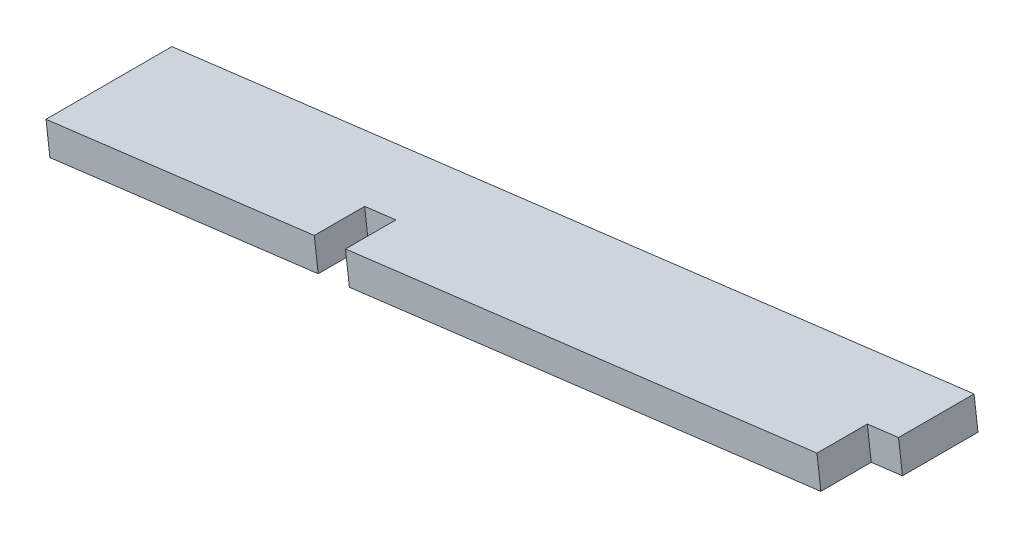
ISO-10303-21;
HEADER;
FILE_DESCRIPTION(('STEP AP214'),'2;1');
FILE_NAME('part.step','',(''),(''),'','','');
FILE_SCHEMA(('AUTOMOTIVE_DESIGN { 1 0 10303 214 1 1 1 1 }'));
ENDSEC;
DATA;
#1=APPLICATION_CONTEXT('core data for automotive mechanical design processes');
#2=APPLICATION_PROTOCOL_DEFINITION('international standard','automotive_design',2000,#1);
#3=PRODUCT_CONTEXT('',#1,'mechanical');
#4=PRODUCT('Part','Part','',(#3));
#5=PRODUCT_RELATED_PRODUCT_CATEGORY('part','',(#4));
#6=PRODUCT_DEFINITION_FORMATION('','',#4);
#7=PRODUCT_DEFINITION_CONTEXT('part definition',#1,'design');
#8=PRODUCT_DEFINITION('design','',#6,#7);
#9=PRODUCT_DEFINITION_SHAPE('','',#8);
#10=(LENGTH_UNIT() NAMED_UNIT(*) SI_UNIT(.MILLI.,.METRE.));
#11=(NAMED_UNIT(*) PLANE_ANGLE_UNIT() SI_UNIT($,.RADIAN.));
#12=(NAMED_UNIT(*) SI_UNIT($,.STERADIAN.) SOLID_ANGLE_UNIT());
#13=UNCERTAINTY_MEASURE_WITH_UNIT(LENGTH_MEASURE(1.E-05),#10,'distance_accuracy_value','');
#14=(GEOMETRIC_REPRESENTATION_CONTEXT(3) GLOBAL_UNCERTAINTY_ASSIGNED_CONTEXT((#13)) GLOBAL_UNIT_ASSIGNED_CONTEXT((#10,
#11,#12)) REPRESENTATION_CONTEXT('',''));
#15=CARTESIAN_POINT('',(0.,0.,0.));
#16=DIRECTION('',(0.,0.,1.));
#17=DIRECTION('',(1.,0.,0.));
#18=AXIS2_PLACEMENT_3D('',#15,#16,#17);
#19=CARTESIAN_POINT('',(370.851540535235,29.3125725278165,-636.696489798407));
#20=DIRECTION('',(-0.992273697444143,-0.124068164170064,0.));
#21=DIRECTION('',(0.124068164170064,-0.992273697444143,0.));
#22=AXIS2_PLACEMENT_3D('',#19,#20,#21);
#23=PLANE('',#22);
#24=DIRECTION('',(0.,0.,-1.));
#25=VECTOR('',#24,1.);
#26=CARTESIAN_POINT('',(371.245456956475,26.1621035384313,-636.696489798407));
#27=LINE('',#26,#25);
#28=CARTESIAN_POINT('',(371.245456956475,26.1621035384313,-636.696489798407));
#29=VERTEX_POINT('',#28);
#30=CARTESIAN_POINT('',(371.245456956475,26.1621035384313,-641.776489798408));
#31=VERTEX_POINT('',#30);
#32=EDGE_CURVE('E143',#29,#31,#27,.T.);
#33=ORIENTED_EDGE('',*,*,#32,.T.);
#34=DIRECTION('',(0.124068164170064,-0.992273697444143,0.));
#35=VECTOR('',#34,1.);
#36=CARTESIAN_POINT('',(370.851540535235,29.3125725278165,-641.776489798408));
#37=LINE('',#36,#35);
#38=CARTESIAN_POINT('',(370.851540535235,29.3125725278165,-641.776489798408));
#39=VERTEX_POINT('',#38);
#40=EDGE_CURVE('E11',#39,#31,#37,.T.);
#41=ORIENTED_EDGE('',*,*,#40,.F.);
#42=DIRECTION('',(0.,0.,-1.));
#43=VECTOR('',#42,1.);
#44=CARTESIAN_POINT('',(370.851540535235,29.3125725278165,-636.696489798407));
#45=LINE('',#44,#43);
#46=CARTESIAN_POINT('',(370.851540535235,29.3125725278165,-636.696489798407));
#47=VERTEX_POINT('',#46);
#48=EDGE_CURVE('E167',#47,#39,#45,.T.);
#49=ORIENTED_EDGE('',*,*,#48,.F.);
#50=DIRECTION('',(0.124068164170064,-0.992273697444143,0.));
#51=VECTOR('',#50,1.);
#52=CARTESIAN_POINT('',(370.851540535235,29.3125725278165,-636.696489798407));
#53=LINE('',#52,#51);
#54=EDGE_CURVE('E49',#47,#29,#53,.T.);
#55=ORIENTED_EDGE('',*,*,#54,.T.);
#56=EDGE_LOOP('',(#33,#41,#49,#55));
#57=FACE_BOUND('',#56,.T.);
#58=ADVANCED_FACE('F33',(#57),#23,.F.);
#59=CARTESIAN_POINT('',(370.851540535235,29.3125725278165,-641.776489798408));
#60=DIRECTION('',(0.,0.,-1.));
#61=DIRECTION('',(-1.,0.,0.));
#62=AXIS2_PLACEMENT_3D('',#59,#60,#61);
#63=PLANE('',#62);
#64=DIRECTION('',(0.992273697444143,0.124068164170062,0.));
#65=VECTOR('',#64,1.);
#66=CARTESIAN_POINT('',(371.245456956475,26.1621035384313,-641.776489798408));
#67=LINE('',#66,#65);
#68=CARTESIAN_POINT('',(374.39592594586,26.5560199596713,-641.776489798408));
#69=VERTEX_POINT('',#68);
#70=EDGE_CURVE('E145',#31,#69,#67,.T.);
#71=ORIENTED_EDGE('',*,*,#70,.T.);
#72=DIRECTION('',(0.124068164170064,-0.992273697444143,0.));
#73=VECTOR('',#72,1.);
#74=CARTESIAN_POINT('',(374.00200952462,29.7064889490564,-641.776489798408));
#75=LINE('',#74,#73);
#76=CARTESIAN_POINT('',(374.00200952462,29.7064889490564,-641.776489798408));
#77=VERTEX_POINT('',#76);
#78=EDGE_CURVE('E41',#77,#69,#75,.T.);
#79=ORIENTED_EDGE('',*,*,#78,.F.);
#80=DIRECTION('',(0.992273697444143,0.124068164170062,0.));
#81=VECTOR('',#80,1.);
#82=CARTESIAN_POINT('',(370.851540535235,29.3125725278165,-641.776489798408));
#83=LINE('',#82,#81);
#84=EDGE_CURVE('E94',#39,#77,#83,.T.);
#85=ORIENTED_EDGE('',*,*,#84,.F.);
#86=ORIENTED_EDGE('',*,*,#40,.T.);
#87=EDGE_LOOP('',(#71,#79,#85,#86));
#88=FACE_BOUND('',#87,.T.);
#89=ADVANCED_FACE('F185',(#88),#63,.F.);
#90=CARTESIAN_POINT('',(374.002006268151,29.7064885418863,-649.396489798407));
#91=DIRECTION('',(0.992273697444051,0.124068164170053,-4.30685786707266E-07));
#92=DIRECTION('',(-0.124068164170064,0.992273697444143,0.));
#93=AXIS2_PLACEMENT_3D('',#90,#91,#92);
#94=PLANE('',#93);
#95=DIRECTION('',(4.27358178008673E-07,5.34343949227783E-08,0.999999999999907));
#96=VECTOR('',#95,1.);
#97=CARTESIAN_POINT('',(374.39592268939,26.5560195525012,-649.396489798407));
#98=LINE('',#97,#96);
#99=CARTESIAN_POINT('',(374.39592268939,26.5560195525012,-649.396489798407));
#100=VERTEX_POINT('',#99);
#101=EDGE_CURVE('E148',#100,#69,#98,.T.);
#102=ORIENTED_EDGE('',*,*,#101,.F.);
#103=DIRECTION('',(0.124068164170064,-0.992273697444143,0.));
#104=VECTOR('',#103,1.);
#105=CARTESIAN_POINT('',(374.002006268151,29.7064885418863,-649.396489798407));
#106=LINE('',#105,#104);
#107=CARTESIAN_POINT('',(374.002006268151,29.7064885418863,-649.396489798407));
#108=VERTEX_POINT('',#107);
#109=EDGE_CURVE('E178',#108,#100,#106,.T.);
#110=ORIENTED_EDGE('',*,*,#109,.F.);
#111=DIRECTION('',(4.27358178008673E-07,5.34343949227783E-08,0.999999999999907));
#112=VECTOR('',#111,1.);
#113=CARTESIAN_POINT('',(374.002006268151,29.7064885418863,-649.396489798407));
#114=LINE('',#113,#112);
#115=EDGE_CURVE('E184',#108,#77,#114,.T.);
#116=ORIENTED_EDGE('',*,*,#115,.T.);
#117=ORIENTED_EDGE('',*,*,#78,.T.);
#118=EDGE_LOOP('',(#102,#110,#116,#117));
#119=FACE_BOUND('',#118,.T.);
#120=ADVANCED_FACE('F182',(#119),#94,.T.);
#121=CARTESIAN_POINT('',(374.002006268151,29.7064885418863,-649.396489798407));
#122=DIRECTION('',(0.,0.,1.));
#123=DIRECTION('',(1.,0.,0.));
#124=AXIS2_PLACEMENT_3D('',#121,#122,#123);
#125=PLANE('',#124);
#126=DIRECTION('',(-0.992273697444143,-0.124068164170064,0.));
#127=VECTOR('',#126,1.);
#128=CARTESIAN_POINT('',(374.39592268939,26.5560195525012,-649.396489798407));
#129=LINE('',#128,#127);
#130=CARTESIAN_POINT('',(293.480518874116,16.4388254453726,-649.396489798407));
#131=VERTEX_POINT('',#130);
#132=EDGE_CURVE('E151',#100,#131,#129,.T.);
#133=ORIENTED_EDGE('',*,*,#132,.T.);
#134=DIRECTION('',(0.124068164170064,-0.992273697444143,0.));
#135=VECTOR('',#134,1.);
#136=CARTESIAN_POINT('',(293.086602452876,19.5892944347578,-649.396489798407));
#137=LINE('',#136,#135);
#138=CARTESIAN_POINT('',(293.086602452876,19.5892944347578,-649.396489798407));
#139=VERTEX_POINT('',#138);
#140=EDGE_CURVE('E175',#139,#131,#137,.T.);
#141=ORIENTED_EDGE('',*,*,#140,.F.);
#142=DIRECTION('',(-0.992273697444143,-0.124068164170064,0.));
#143=VECTOR('',#142,1.);
#144=CARTESIAN_POINT('',(374.002006268151,29.7064885418863,-649.396489798407));
#145=LINE('',#144,#143);
#146=EDGE_CURVE('E202',#108,#139,#145,.T.);
#147=ORIENTED_EDGE('',*,*,#146,.F.);
#148=ORIENTED_EDGE('',*,*,#109,.T.);
#149=EDGE_LOOP('',(#133,#141,#147,#148));
#150=FACE_BOUND('',#149,.T.);
#151=ADVANCED_FACE('F193',(#150),#125,.F.);
#152=CARTESIAN_POINT('',(293.086602452876,19.5892944347578,-649.396489798407));
#153=DIRECTION('',(0.992273697444143,0.124068164170064,0.));
#154=DIRECTION('',(-0.124068164170064,0.992273697444143,0.));
#155=AXIS2_PLACEMENT_3D('',#152,#153,#154);
#156=PLANE('',#155);
#157=DIRECTION('',(0.,0.,1.));
#158=VECTOR('',#157,1.);
#159=CARTESIAN_POINT('',(293.480518874116,16.4388254453726,-649.396489798407));
#160=LINE('',#159,#158);
#161=CARTESIAN_POINT('',(293.480518874116,16.4388254453726,-636.696489798407));
#162=VERTEX_POINT('',#161);
#163=EDGE_CURVE('E153',#131,#162,#160,.T.);
#164=ORIENTED_EDGE('',*,*,#163,.T.);
#165=DIRECTION('',(0.124068164170064,-0.992273697444143,0.));
#166=VECTOR('',#165,1.);
#167=CARTESIAN_POINT('',(293.086602452876,19.5892944347578,-636.696489798407));
#168=LINE('',#167,#166);
#169=CARTESIAN_POINT('',(293.086602452876,19.5892944347578,-636.696489798407));
#170=VERTEX_POINT('',#169);
#171=EDGE_CURVE('E173',#170,#162,#168,.T.);
#172=ORIENTED_EDGE('',*,*,#171,.F.);
#173=DIRECTION('',(0.,0.,1.));
#174=VECTOR('',#173,1.);
#175=CARTESIAN_POINT('',(293.086602452876,19.5892944347578,-649.396489798407));
#176=LINE('',#175,#174);
#177=EDGE_CURVE('E199',#139,#170,#176,.T.);
#178=ORIENTED_EDGE('',*,*,#177,.F.);
#179=ORIENTED_EDGE('',*,*,#140,.T.);
#180=EDGE_LOOP('',(#164,#172,#178,#179));
#181=FACE_BOUND('',#180,.T.);
#182=ADVANCED_FACE('F197',(#181),#156,.F.);
#183=CARTESIAN_POINT('',(320.148114829322,22.9729094281403,-636.696489798407));
#184=DIRECTION('',(0.,0.,1.));
#185=DIRECTION('',(1.,0.,0.));
#186=AXIS2_PLACEMENT_3D('',#183,#184,#185);
#187=PLANE('',#186);
#188=DIRECTION('',(-0.992273697444143,-0.124068164170064,0.));
#189=VECTOR('',#188,1.);
#190=CARTESIAN_POINT('',(320.542031250562,19.8224404387551,-636.696489798407));
#191=LINE('',#190,#189);
#192=CARTESIAN_POINT('',(320.542031250562,19.8224404387551,-636.696489798407));
#193=VERTEX_POINT('',#192);
#194=EDGE_CURVE('E156',#193,#162,#191,.T.);
#195=ORIENTED_EDGE('',*,*,#194,.F.);
#196=DIRECTION('',(0.124068164170064,-0.992273697444143,0.));
#197=VECTOR('',#196,1.);
#198=CARTESIAN_POINT('',(320.148114829322,22.9729094281403,-636.696489798407));
#199=LINE('',#198,#197);
#200=CARTESIAN_POINT('',(320.148114829322,22.9729094281403,-636.696489798407));
#201=VERTEX_POINT('',#200);
#202=EDGE_CURVE('E171',#201,#193,#199,.T.);
#203=ORIENTED_EDGE('',*,*,#202,.F.);
#204=DIRECTION('',(-0.992273697444143,-0.124068164170064,0.));
#205=VECTOR('',#204,1.);
#206=CARTESIAN_POINT('',(320.148114829322,22.9729094281403,-636.696489798407));
#207=LINE('',#206,#205);
#208=EDGE_CURVE('E201',#201,#170,#207,.T.);
#209=ORIENTED_EDGE('',*,*,#208,.T.);
#210=ORIENTED_EDGE('',*,*,#171,.T.);
#211=EDGE_LOOP('',(#195,#203,#209,#210));
#212=FACE_BOUND('',#211,.T.);
#213=ADVANCED_FACE('F232',(#212),#187,.T.);
#214=CARTESIAN_POINT('',(320.148114829322,22.9729094281403,-636.696489798407));
#215=DIRECTION('',(-0.992273697444143,-0.124068164170064,0.));
#216=DIRECTION('',(0.124068164170064,-0.992273697444143,0.));
#217=AXIS2_PLACEMENT_3D('',#214,#215,#216);
#218=PLANE('',#217);
#219=DIRECTION('',(0.,0.,-1.));
#220=VECTOR('',#219,1.);
#221=CARTESIAN_POINT('',(320.542031250562,19.8224404387551,-636.696489798407));
#222=LINE('',#221,#220);
#223=CARTESIAN_POINT('',(320.542031250562,19.8224404387552,-641.776487593536));
#224=VERTEX_POINT('',#223);
#225=EDGE_CURVE('E159',#193,#224,#222,.T.);
#226=ORIENTED_EDGE('',*,*,#225,.T.);
#227=DIRECTION('',(0.124068164170064,-0.992273697444143,0.));
#228=VECTOR('',#227,1.);
#229=CARTESIAN_POINT('',(320.148114829322,22.9729094281403,-641.776487593536));
#230=LINE('',#229,#228);
#231=CARTESIAN_POINT('',(320.148114829322,22.9729094281403,-641.776487593536));
#232=VERTEX_POINT('',#231);
#233=EDGE_CURVE('E135',#232,#224,#230,.T.);
#234=ORIENTED_EDGE('',*,*,#233,.F.);
#235=DIRECTION('',(0.,0.,-1.));
#236=VECTOR('',#235,1.);
#237=CARTESIAN_POINT('',(320.148114829322,22.9729094281403,-636.696489798407));
#238=LINE('',#237,#236);
#239=EDGE_CURVE('E123',#201,#232,#238,.T.);
#240=ORIENTED_EDGE('',*,*,#239,.F.);
#241=ORIENTED_EDGE('',*,*,#202,.T.);
#242=EDGE_LOOP('',(#226,#234,#240,#241));
#243=FACE_BOUND('',#242,.T.);
#244=ADVANCED_FACE('F235',(#243),#218,.F.);
#245=CARTESIAN_POINT('',(320.148114829322,22.9729094281403,-641.776487593536));
#246=DIRECTION('',(0.,0.,-1.));
#247=DIRECTION('',(-1.,0.,0.));
#248=AXIS2_PLACEMENT_3D('',#245,#246,#247);
#249=PLANE('',#248);
#250=DIRECTION('',(0.992273697444143,0.124068164170064,0.));
#251=VECTOR('',#250,1.);
#252=CARTESIAN_POINT('',(320.542031250562,19.8224404387552,-641.776487593536));
#253=LINE('',#252,#251);
#254=CARTESIAN_POINT('',(323.692500239947,20.2163568599951,-641.776487593536));
#255=VERTEX_POINT('',#254);
#256=EDGE_CURVE('E132',#224,#255,#253,.T.);
#257=ORIENTED_EDGE('',*,*,#256,.T.);
#258=DIRECTION('',(0.124068164170064,-0.992273697444143,0.));
#259=VECTOR('',#258,1.);
#260=CARTESIAN_POINT('',(323.298583818707,23.3668258493803,-641.776487593536));
#261=LINE('',#260,#259);
#262=CARTESIAN_POINT('',(323.298583818707,23.3668258493803,-641.776487593536));
#263=VERTEX_POINT('',#262);
#264=EDGE_CURVE('E129',#263,#255,#261,.T.);
#265=ORIENTED_EDGE('',*,*,#264,.F.);
#266=DIRECTION('',(0.992273697444143,0.124068164170064,0.));
#267=VECTOR('',#266,1.);
#268=CARTESIAN_POINT('',(320.148114829322,22.9729094281403,-641.776487593536));
#269=LINE('',#268,#267);
#270=EDGE_CURVE('E115',#232,#263,#269,.T.);
#271=ORIENTED_EDGE('',*,*,#270,.F.);
#272=ORIENTED_EDGE('',*,*,#233,.T.);
#273=EDGE_LOOP('',(#257,#265,#271,#272));
#274=FACE_BOUND('',#273,.T.);
#275=ADVANCED_FACE('F130',(#274),#249,.F.);
#276=CARTESIAN_POINT('',(323.298583818707,23.3668258493803,-641.776487593536));
#277=DIRECTION('',(0.992273266767776,0.124068110320782,0.000931697073093313));
#278=DIRECTION('',(-0.124068164170064,0.992273697444143,0.));
#279=AXIS2_PLACEMENT_3D('',#276,#277,#278);
#280=PLANE('',#279);
#281=DIRECTION('',(-0.00092449849961617,-0.00011559394542145,0.999999565970188));
#282=VECTOR('',#281,1.);
#283=CARTESIAN_POINT('',(323.692500239947,20.2163568599951,-641.776487593536));
#284=LINE('',#283,#282);
#285=CARTESIAN_POINT('',(323.687803787569,20.2157696427524,-636.696489798407));
#286=VERTEX_POINT('',#285);
#287=EDGE_CURVE('E162',#255,#286,#284,.T.);
#288=ORIENTED_EDGE('',*,*,#287,.T.);
#289=DIRECTION('',(0.124068164170064,-0.992273697444143,0.));
#290=VECTOR('',#289,1.);
#291=CARTESIAN_POINT('',(323.293887366329,23.3662386321375,-636.696489798407));
#292=LINE('',#291,#290);
#293=CARTESIAN_POINT('',(323.293887366329,23.3662386321375,-636.696489798407));
#294=VERTEX_POINT('',#293);
#295=EDGE_CURVE('E82',#294,#286,#292,.T.);
#296=ORIENTED_EDGE('',*,*,#295,.F.);
#297=DIRECTION('',(-0.00092449849961617,-0.00011559394542145,0.999999565970188));
#298=VECTOR('',#297,1.);
#299=CARTESIAN_POINT('',(323.298583818707,23.3668258493803,-641.776487593536));
#300=LINE('',#299,#298);
#301=EDGE_CURVE('E120',#263,#294,#300,.T.);
#302=ORIENTED_EDGE('',*,*,#301,.F.);
#303=ORIENTED_EDGE('',*,*,#264,.T.);
#304=EDGE_LOOP('',(#288,#296,#302,#303));
#305=FACE_BOUND('',#304,.T.);
#306=ADVANCED_FACE('F137',(#305),#280,.F.);
#307=CARTESIAN_POINT('',(370.851540535235,29.3125725278165,-636.696489798407));
#308=DIRECTION('',(0.,0.,1.));
#309=DIRECTION('',(1.,0.,0.));
#310=AXIS2_PLACEMENT_3D('',#307,#308,#309);
#311=PLANE('',#310);
#312=DIRECTION('',(-0.992273697444143,-0.124068164170064,0.));
#313=VECTOR('',#312,1.);
#314=CARTESIAN_POINT('',(371.245456956475,26.1621035384313,-636.696489798407));
#315=LINE('',#314,#313);
#316=EDGE_CURVE('E164',#29,#286,#315,.T.);
#317=ORIENTED_EDGE('',*,*,#316,.F.);
#318=ORIENTED_EDGE('',*,*,#54,.F.);
#319=DIRECTION('',(-0.992273697444143,-0.124068164170064,0.));
#320=VECTOR('',#319,1.);
#321=CARTESIAN_POINT('',(370.851540535235,29.3125725278165,-636.696489798407));
#322=LINE('',#321,#320);
#323=EDGE_CURVE('E138',#47,#294,#322,.T.);
#324=ORIENTED_EDGE('',*,*,#323,.T.);
#325=ORIENTED_EDGE('',*,*,#295,.T.);
#326=EDGE_LOOP('',(#317,#318,#324,#325));
#327=FACE_BOUND('',#326,.T.);
#328=ADVANCED_FACE('F209',(#327),#311,.T.);
#329=CARTESIAN_POINT('',(2.09982577441617,-16.7940091570342,0.));
#330=DIRECTION('',(0.124068164170062,-0.992273697444143,0.));
#331=DIRECTION('',(0.992273697444143,0.124068164170062,0.));
#332=AXIS2_PLACEMENT_3D('',#329,#330,#331);
#333=PLANE('',#332);
#334=ORIENTED_EDGE('',*,*,#48,.T.);
#335=ORIENTED_EDGE('',*,*,#84,.T.);
#336=ORIENTED_EDGE('',*,*,#115,.F.);
#337=ORIENTED_EDGE('',*,*,#146,.T.);
#338=ORIENTED_EDGE('',*,*,#177,.T.);
#339=ORIENTED_EDGE('',*,*,#208,.F.);
#340=ORIENTED_EDGE('',*,*,#239,.T.);
#341=ORIENTED_EDGE('',*,*,#270,.T.);
#342=ORIENTED_EDGE('',*,*,#301,.T.);
#343=ORIENTED_EDGE('',*,*,#323,.F.);
#344=EDGE_LOOP('',(#334,#335,#336,#337,#338,#339,#340,#341,#342,#343));
#345=FACE_BOUND('',#344,.T.);
#346=ADVANCED_FACE('F117',(#345),#333,.F.);
#347=CARTESIAN_POINT('',(2.49374219565613,-19.9444781464194,0.));
#348=DIRECTION('',(0.124068164170062,-0.992273697444143,0.));
#349=DIRECTION('',(0.992273697444143,0.124068164170062,0.));
#350=AXIS2_PLACEMENT_3D('',#347,#348,#349);
#351=PLANE('',#350);
#352=ORIENTED_EDGE('',*,*,#32,.F.);
#353=ORIENTED_EDGE('',*,*,#316,.T.);
#354=ORIENTED_EDGE('',*,*,#287,.F.);
#355=ORIENTED_EDGE('',*,*,#256,.F.);
#356=ORIENTED_EDGE('',*,*,#225,.F.);
#357=ORIENTED_EDGE('',*,*,#194,.T.);
#358=ORIENTED_EDGE('',*,*,#163,.F.);
#359=ORIENTED_EDGE('',*,*,#132,.F.);
#360=ORIENTED_EDGE('',*,*,#101,.T.);
#361=ORIENTED_EDGE('',*,*,#70,.F.);
#362=EDGE_LOOP('',(#352,#353,#354,#355,#356,#357,#358,#359,#360,#361));
#363=FACE_BOUND('',#362,.T.);
#364=ADVANCED_FACE('F189',(#363),#351,.T.);
#365=CLOSED_SHELL('',(#58,#89,#120,#151,#182,#213,#244,#275,#306,#328,#346,#364));
#366=MANIFOLD_SOLID_BREP('B2',#365);
#367=ADVANCED_BREP_SHAPE_REPRESENTATION('',(#18,#366),#14);
#368=SHAPE_DEFINITION_REPRESENTATION(#9,#367);
ENDSEC;
END-ISO-10303-21;
